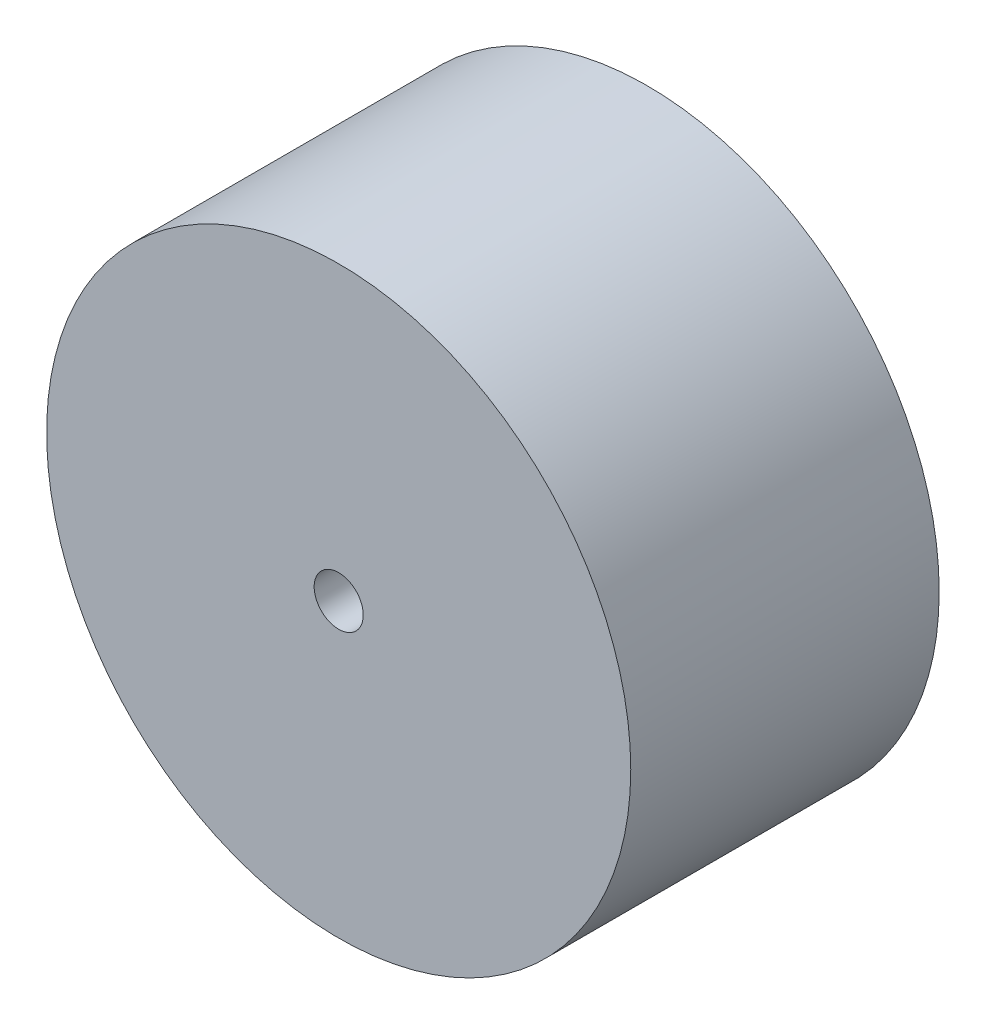
ISO-10303-21;
HEADER;
FILE_DESCRIPTION(('STEP AP214'),'2;1');
FILE_NAME('part.step','',(''),(''),'','','');
FILE_SCHEMA(('AUTOMOTIVE_DESIGN { 1 0 10303 214 1 1 1 1 }'));
ENDSEC;
DATA;
#1=APPLICATION_CONTEXT('core data for automotive mechanical design processes');
#2=APPLICATION_PROTOCOL_DEFINITION('international standard','automotive_design',2000,#1);
#3=PRODUCT_CONTEXT('',#1,'mechanical');
#4=PRODUCT('Part','Part','',(#3));
#5=PRODUCT_RELATED_PRODUCT_CATEGORY('part','',(#4));
#6=PRODUCT_DEFINITION_FORMATION('','',#4);
#7=PRODUCT_DEFINITION_CONTEXT('part definition',#1,'design');
#8=PRODUCT_DEFINITION('design','',#6,#7);
#9=PRODUCT_DEFINITION_SHAPE('','',#8);
#10=(LENGTH_UNIT() NAMED_UNIT(*) SI_UNIT(.MILLI.,.METRE.));
#11=(NAMED_UNIT(*) PLANE_ANGLE_UNIT() SI_UNIT($,.RADIAN.));
#12=(NAMED_UNIT(*) SI_UNIT($,.STERADIAN.) SOLID_ANGLE_UNIT());
#13=UNCERTAINTY_MEASURE_WITH_UNIT(LENGTH_MEASURE(1.E-05),#10,'distance_accuracy_value','');
#14=(GEOMETRIC_REPRESENTATION_CONTEXT(3) GLOBAL_UNCERTAINTY_ASSIGNED_CONTEXT((#13)) GLOBAL_UNIT_ASSIGNED_CONTEXT((#10,
#11,#12)) REPRESENTATION_CONTEXT('',''));
#15=CARTESIAN_POINT('',(0.,0.,0.));
#16=DIRECTION('',(0.,0.,1.));
#17=DIRECTION('',(1.,0.,0.));
#18=AXIS2_PLACEMENT_3D('',#15,#16,#17);
#19=CARTESIAN_POINT('',(0.,0.,13.2));
#20=DIRECTION('',(0.,0.,-1.));
#21=DIRECTION('',(-1.,0.,0.));
#22=AXIS2_PLACEMENT_3D('',#19,#20,#21);
#23=CYLINDRICAL_SURFACE('',#22,25.);
#24=CARTESIAN_POINT('',(0.,0.,13.2));
#25=DIRECTION('',(0.,0.,1.));
#26=DIRECTION('',(1.,0.,0.));
#27=AXIS2_PLACEMENT_3D('',#24,#25,#26);
#28=CIRCLE('',#27,25.);
#29=CARTESIAN_POINT('',(25.,0.,13.2));
#30=VERTEX_POINT('',#29);
#31=EDGE_CURVE('E11',#30,#30,#28,.T.);
#32=ORIENTED_EDGE('',*,*,#31,.F.);
#33=EDGE_LOOP('',(#32));
#34=FACE_BOUND('',#33,.T.);
#35=CARTESIAN_POINT('',(0.,0.,-13.2));
#36=DIRECTION('',(0.,0.,1.));
#37=DIRECTION('',(1.,0.,0.));
#38=AXIS2_PLACEMENT_3D('',#35,#36,#37);
#39=CIRCLE('',#38,25.);
#40=CARTESIAN_POINT('',(25.,0.,-13.2));
#41=VERTEX_POINT('',#40);
#42=EDGE_CURVE('E44',#41,#41,#39,.T.);
#43=ORIENTED_EDGE('',*,*,#42,.T.);
#44=EDGE_LOOP('',(#43));
#45=FACE_BOUND('',#44,.T.);
#46=ADVANCED_FACE('F41',(#34,#45),#23,.T.);
#47=CARTESIAN_POINT('',(0.,0.,13.2));
#48=DIRECTION('',(0.,0.,1.));
#49=DIRECTION('',(1.,0.,0.));
#50=AXIS2_PLACEMENT_3D('',#47,#48,#49);
#51=PLANE('',#50);
#52=CARTESIAN_POINT('',(0.,0.,13.2));
#53=DIRECTION('',(0.,0.,1.));
#54=DIRECTION('',(1.,0.,0.));
#55=AXIS2_PLACEMENT_3D('',#52,#53,#54);
#56=CIRCLE('',#55,2.09999999999999);
#57=CARTESIAN_POINT('',(2.09999999999999,0.,13.2));
#58=VERTEX_POINT('',#57);
#59=EDGE_CURVE('E60',#58,#58,#56,.T.);
#60=ORIENTED_EDGE('',*,*,#59,.F.);
#61=EDGE_LOOP('',(#60));
#62=FACE_BOUND('',#61,.T.);
#63=ORIENTED_EDGE('',*,*,#31,.T.);
#64=EDGE_LOOP('',(#63));
#65=FACE_BOUND('',#64,.T.);
#66=ADVANCED_FACE('F68',(#62,#65),#51,.T.);
#67=CARTESIAN_POINT('',(0.,0.,-13.2));
#68=DIRECTION('',(0.,0.,1.));
#69=DIRECTION('',(1.,0.,0.));
#70=AXIS2_PLACEMENT_3D('',#67,#68,#69);
#71=PLANE('',#70);
#72=ORIENTED_EDGE('',*,*,#42,.F.);
#73=EDGE_LOOP('',(#72));
#74=FACE_BOUND('',#73,.T.);
#75=ADVANCED_FACE('F54',(#74),#71,.F.);
#76=CARTESIAN_POINT('',(0.,0.,6.85));
#77=DIRECTION('',(0.,0.,1.));
#78=DIRECTION('',(1.,0.,0.));
#79=AXIS2_PLACEMENT_3D('',#76,#77,#78);
#80=CONICAL_SURFACE('',#79,2.1,1.02974425867665);
#81=CARTESIAN_POINT('',(0.,0.,5.58819270004212));
#82=VERTEX_POINT('',#81);
#83=VERTEX_LOOP('',#82);
#84=FACE_BOUND('',#83,.T.);
#85=CARTESIAN_POINT('',(0.,0.,6.85));
#86=DIRECTION('',(0.,0.,1.));
#87=DIRECTION('',(1.,0.,0.));
#88=AXIS2_PLACEMENT_3D('',#85,#86,#87);
#89=CIRCLE('',#88,2.1);
#90=CARTESIAN_POINT('',(2.1,0.,6.85));
#91=VERTEX_POINT('',#90);
#92=EDGE_CURVE('E58',#91,#91,#89,.T.);
#93=ORIENTED_EDGE('',*,*,#92,.T.);
#94=EDGE_LOOP('',(#93));
#95=FACE_BOUND('',#94,.T.);
#96=ADVANCED_FACE('F50',(#84,#95),#80,.F.);
#97=CARTESIAN_POINT('',(0.,0.,13.2));
#98=DIRECTION('',(0.,0.,1.));
#99=DIRECTION('',(1.,0.,0.));
#100=AXIS2_PLACEMENT_3D('',#97,#98,#99);
#101=CYLINDRICAL_SURFACE('',#100,2.09999999999999);
#102=ORIENTED_EDGE('',*,*,#92,.F.);
#103=EDGE_LOOP('',(#102));
#104=FACE_BOUND('',#103,.T.);
#105=ORIENTED_EDGE('',*,*,#59,.T.);
#106=EDGE_LOOP('',(#105));
#107=FACE_BOUND('',#106,.T.);
#108=ADVANCED_FACE('F53',(#104,#107),#101,.F.);
#109=CLOSED_SHELL('',(#46,#66,#75,#96,#108));
#110=MANIFOLD_SOLID_BREP('B2',#109);
#111=ADVANCED_BREP_SHAPE_REPRESENTATION('',(#18,#110),#14);
#112=SHAPE_DEFINITION_REPRESENTATION(#9,#111);
ENDSEC;
END-ISO-10303-21;
